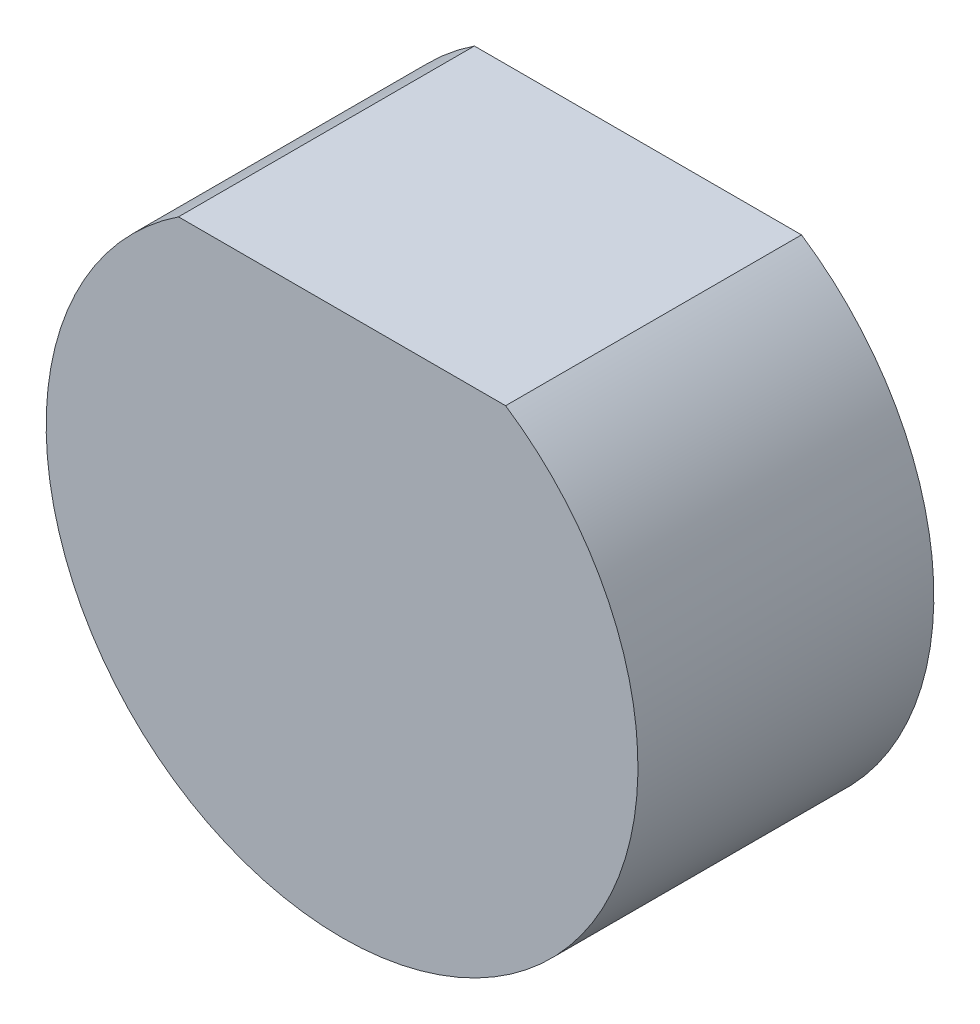
ISO-10303-21;
HEADER;
FILE_DESCRIPTION(('STEP AP214'),'2;1');
FILE_NAME('part.step','',(''),(''),'','','');
FILE_SCHEMA(('AUTOMOTIVE_DESIGN { 1 0 10303 214 1 1 1 1 }'));
ENDSEC;
DATA;
#1=APPLICATION_CONTEXT('core data for automotive mechanical design processes');
#2=APPLICATION_PROTOCOL_DEFINITION('international standard','automotive_design',2000,#1);
#3=PRODUCT_CONTEXT('',#1,'mechanical');
#4=PRODUCT('Part','Part','',(#3));
#5=PRODUCT_RELATED_PRODUCT_CATEGORY('part','',(#4));
#6=PRODUCT_DEFINITION_FORMATION('','',#4);
#7=PRODUCT_DEFINITION_CONTEXT('part definition',#1,'design');
#8=PRODUCT_DEFINITION('design','',#6,#7);
#9=PRODUCT_DEFINITION_SHAPE('','',#8);
#10=(LENGTH_UNIT() NAMED_UNIT(*) SI_UNIT(.MILLI.,.METRE.));
#11=(NAMED_UNIT(*) PLANE_ANGLE_UNIT() SI_UNIT($,.RADIAN.));
#12=(NAMED_UNIT(*) SI_UNIT($,.STERADIAN.) SOLID_ANGLE_UNIT());
#13=UNCERTAINTY_MEASURE_WITH_UNIT(LENGTH_MEASURE(1.E-05),#10,'distance_accuracy_value','');
#14=(GEOMETRIC_REPRESENTATION_CONTEXT(3) GLOBAL_UNCERTAINTY_ASSIGNED_CONTEXT((#13)) GLOBAL_UNIT_ASSIGNED_CONTEXT((#10,
#11,#12)) REPRESENTATION_CONTEXT('',''));
#15=CARTESIAN_POINT('',(0.,0.,0.));
#16=DIRECTION('',(0.,0.,1.));
#17=DIRECTION('',(1.,0.,0.));
#18=AXIS2_PLACEMENT_3D('',#15,#16,#17);
#19=CARTESIAN_POINT('',(0.,0.,6.));
#20=DIRECTION('',(0.,0.,-1.));
#21=DIRECTION('',(-1.,0.,0.));
#22=AXIS2_PLACEMENT_3D('',#19,#20,#21);
#23=CYLINDRICAL_SURFACE('',#22,6.);
#24=CARTESIAN_POINT('',(0.,0.,0.));
#25=DIRECTION('',(0.,0.,1.));
#26=DIRECTION('',(1.,0.,0.));
#27=AXIS2_PLACEMENT_3D('',#24,#25,#26);
#28=CIRCLE('',#27,6.);
#29=CARTESIAN_POINT('',(-3.3166247903554,5.,0.));
#30=VERTEX_POINT('',#29);
#31=CARTESIAN_POINT('',(3.3166247903554,5.,0.));
#32=VERTEX_POINT('',#31);
#33=EDGE_CURVE('E64',#30,#32,#28,.T.);
#34=ORIENTED_EDGE('',*,*,#33,.T.);
#35=DIRECTION('',(0.,0.,-1.));
#36=VECTOR('',#35,1.);
#37=CARTESIAN_POINT('',(3.3166247903554,5.,6.));
#38=LINE('',#37,#36);
#39=CARTESIAN_POINT('',(3.3166247903554,5.,6.));
#40=VERTEX_POINT('',#39);
#41=EDGE_CURVE('E11',#40,#32,#38,.T.);
#42=ORIENTED_EDGE('',*,*,#41,.F.);
#43=CARTESIAN_POINT('',(0.,0.,6.));
#44=DIRECTION('',(0.,0.,1.));
#45=DIRECTION('',(1.,0.,0.));
#46=AXIS2_PLACEMENT_3D('',#43,#44,#45);
#47=CIRCLE('',#46,6.);
#48=CARTESIAN_POINT('',(-3.3166247903554,5.,6.));
#49=VERTEX_POINT('',#48);
#50=EDGE_CURVE('E63',#49,#40,#47,.T.);
#51=ORIENTED_EDGE('',*,*,#50,.F.);
#52=DIRECTION('',(0.,0.,-1.));
#53=VECTOR('',#52,1.);
#54=CARTESIAN_POINT('',(-3.3166247903554,5.,6.));
#55=LINE('',#54,#53);
#56=EDGE_CURVE('E41',#49,#30,#55,.T.);
#57=ORIENTED_EDGE('',*,*,#56,.T.);
#58=EDGE_LOOP('',(#34,#42,#51,#57));
#59=FACE_BOUND('',#58,.T.);
#60=ADVANCED_FACE('F33',(#59),#23,.T.);
#61=CARTESIAN_POINT('',(-3.3166247903554,5.,6.));
#62=DIRECTION('',(0.,-1.,0.));
#63=DIRECTION('',(0.,0.,-1.));
#64=AXIS2_PLACEMENT_3D('',#61,#62,#63);
#65=PLANE('',#64);
#66=DIRECTION('',(-1.,0.,0.));
#67=VECTOR('',#66,1.);
#68=CARTESIAN_POINT('',(-3.3166247903554,5.,0.));
#69=LINE('',#68,#67);
#70=EDGE_CURVE('E56',#32,#30,#69,.T.);
#71=ORIENTED_EDGE('',*,*,#70,.T.);
#72=ORIENTED_EDGE('',*,*,#56,.F.);
#73=DIRECTION('',(-1.,0.,0.));
#74=VECTOR('',#73,1.);
#75=CARTESIAN_POINT('',(-3.3166247903554,5.,6.));
#76=LINE('',#75,#74);
#77=EDGE_CURVE('E48',#40,#49,#76,.T.);
#78=ORIENTED_EDGE('',*,*,#77,.F.);
#79=ORIENTED_EDGE('',*,*,#41,.T.);
#80=EDGE_LOOP('',(#71,#72,#78,#79));
#81=FACE_BOUND('',#80,.T.);
#82=ADVANCED_FACE('F59',(#81),#65,.F.);
#83=CARTESIAN_POINT('',(0.,0.,6.));
#84=DIRECTION('',(0.,0.,1.));
#85=DIRECTION('',(1.,0.,0.));
#86=AXIS2_PLACEMENT_3D('',#83,#84,#85);
#87=PLANE('',#86);
#88=ORIENTED_EDGE('',*,*,#50,.T.);
#89=ORIENTED_EDGE('',*,*,#77,.T.);
#90=EDGE_LOOP('',(#88,#89));
#91=FACE_BOUND('',#90,.T.);
#92=ADVANCED_FACE('F71',(#91),#87,.T.);
#93=CARTESIAN_POINT('',(0.,0.,0.));
#94=DIRECTION('',(0.,0.,1.));
#95=DIRECTION('',(1.,0.,0.));
#96=AXIS2_PLACEMENT_3D('',#93,#94,#95);
#97=PLANE('',#96);
#98=ORIENTED_EDGE('',*,*,#33,.F.);
#99=ORIENTED_EDGE('',*,*,#70,.F.);
#100=EDGE_LOOP('',(#98,#99));
#101=FACE_BOUND('',#100,.T.);
#102=ADVANCED_FACE('F67',(#101),#97,.F.);
#103=CLOSED_SHELL('',(#60,#82,#92,#102));
#104=MANIFOLD_SOLID_BREP('B2',#103);
#105=ADVANCED_BREP_SHAPE_REPRESENTATION('',(#18,#104),#14);
#106=SHAPE_DEFINITION_REPRESENTATION(#9,#105);
ENDSEC;
END-ISO-10303-21;
